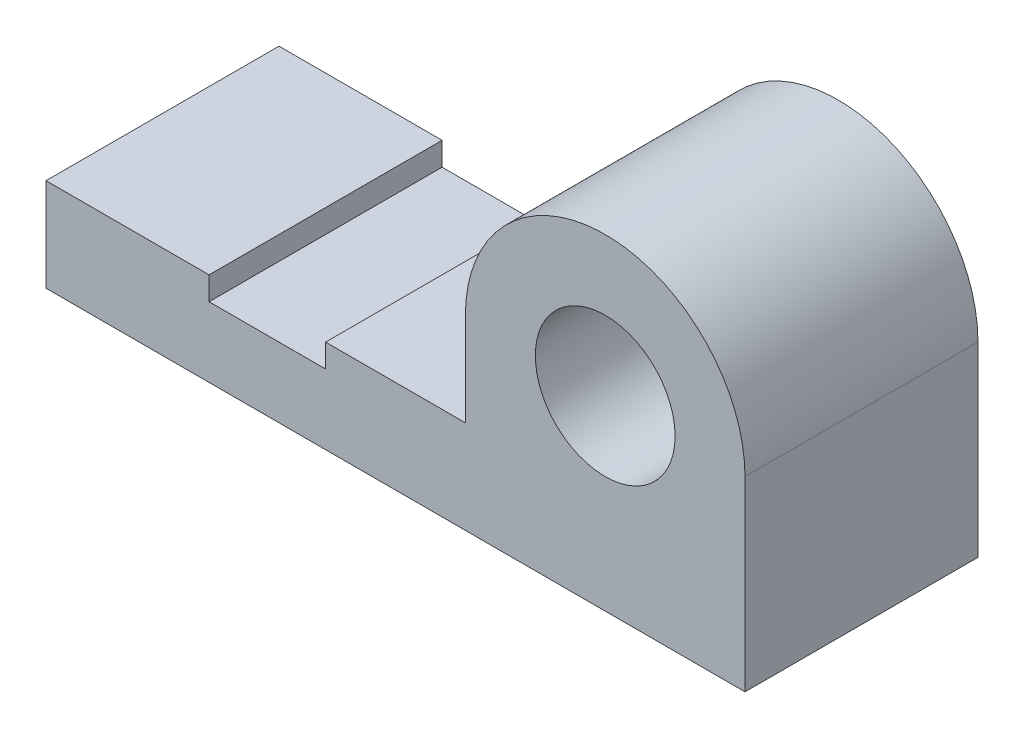
ISO-10303-21;
HEADER;
FILE_DESCRIPTION(('STEP AP214'),'2;1');
FILE_NAME('part.step','',(''),(''),'','','');
FILE_SCHEMA(('AUTOMOTIVE_DESIGN { 1 0 10303 214 1 1 1 1 }'));
ENDSEC;
DATA;
#1=APPLICATION_CONTEXT('core data for automotive mechanical design processes');
#2=APPLICATION_PROTOCOL_DEFINITION('international standard','automotive_design',2000,#1);
#3=PRODUCT_CONTEXT('',#1,'mechanical');
#4=PRODUCT('Part','Part','',(#3));
#5=PRODUCT_RELATED_PRODUCT_CATEGORY('part','',(#4));
#6=PRODUCT_DEFINITION_FORMATION('','',#4);
#7=PRODUCT_DEFINITION_CONTEXT('part definition',#1,'design');
#8=PRODUCT_DEFINITION('design','',#6,#7);
#9=PRODUCT_DEFINITION_SHAPE('','',#8);
#10=(LENGTH_UNIT() NAMED_UNIT(*) SI_UNIT(.MILLI.,.METRE.));
#11=(NAMED_UNIT(*) PLANE_ANGLE_UNIT() SI_UNIT($,.RADIAN.));
#12=(NAMED_UNIT(*) SI_UNIT($,.STERADIAN.) SOLID_ANGLE_UNIT());
#13=UNCERTAINTY_MEASURE_WITH_UNIT(LENGTH_MEASURE(1.E-05),#10,'distance_accuracy_value','');
#14=(GEOMETRIC_REPRESENTATION_CONTEXT(3) GLOBAL_UNCERTAINTY_ASSIGNED_CONTEXT((#13)) GLOBAL_UNIT_ASSIGNED_CONTEXT((#10,
#11,#12)) REPRESENTATION_CONTEXT('',''));
#15=CARTESIAN_POINT('',(0.,0.,0.));
#16=DIRECTION('',(0.,0.,1.));
#17=DIRECTION('',(1.,0.,0.));
#18=AXIS2_PLACEMENT_3D('',#15,#16,#17);
#19=CARTESIAN_POINT('',(-30.,40.,50.));
#20=DIRECTION('',(0.,0.,-1.));
#21=DIRECTION('',(-1.,0.,0.));
#22=AXIS2_PLACEMENT_3D('',#19,#20,#21);
#23=CYLINDRICAL_SURFACE('',#22,30.);
#24=CARTESIAN_POINT('',(-30.,40.,0.));
#25=DIRECTION('',(0.,0.,1.));
#26=DIRECTION('',(1.,0.,0.));
#27=AXIS2_PLACEMENT_3D('',#24,#25,#26);
#28=CIRCLE('',#27,30.);
#29=CARTESIAN_POINT('',(-60.,40.,0.));
#30=VERTEX_POINT('',#29);
#31=CARTESIAN_POINT('',(0.,40.,0.));
#32=VERTEX_POINT('',#31);
#33=EDGE_CURVE('E146',#30,#32,#28,.F.);
#34=ORIENTED_EDGE('',*,*,#33,.F.);
#35=DIRECTION('',(0.,0.,-1.));
#36=VECTOR('',#35,1.);
#37=CARTESIAN_POINT('',(-60.,40.,50.));
#38=LINE('',#37,#36);
#39=CARTESIAN_POINT('',(-60.,40.,50.));
#40=VERTEX_POINT('',#39);
#41=EDGE_CURVE('E11',#40,#30,#38,.T.);
#42=ORIENTED_EDGE('',*,*,#41,.F.);
#43=CARTESIAN_POINT('',(-30.,40.,50.));
#44=DIRECTION('',(0.,0.,1.));
#45=DIRECTION('',(1.,0.,0.));
#46=AXIS2_PLACEMENT_3D('',#43,#44,#45);
#47=CIRCLE('',#46,30.);
#48=CARTESIAN_POINT('',(0.,40.,50.));
#49=VERTEX_POINT('',#48);
#50=EDGE_CURVE('E209',#40,#49,#47,.F.);
#51=ORIENTED_EDGE('',*,*,#50,.T.);
#52=DIRECTION('',(0.,0.,-1.));
#53=VECTOR('',#52,1.);
#54=CARTESIAN_POINT('',(0.,40.,50.));
#55=LINE('',#54,#53);
#56=EDGE_CURVE('E54',#49,#32,#55,.T.);
#57=ORIENTED_EDGE('',*,*,#56,.T.);
#58=EDGE_LOOP('',(#34,#42,#51,#57));
#59=FACE_BOUND('',#58,.T.);
#60=ADVANCED_FACE('F37',(#59),#23,.T.);
#61=CARTESIAN_POINT('',(-60.,0.,50.));
#62=DIRECTION('',(-1.,0.,0.));
#63=DIRECTION('',(0.,-1.,0.));
#64=AXIS2_PLACEMENT_3D('',#61,#62,#63);
#65=PLANE('',#64);
#66=DIRECTION('',(0.,1.,0.));
#67=VECTOR('',#66,1.);
#68=CARTESIAN_POINT('',(-60.,0.,0.));
#69=LINE('',#68,#67);
#70=CARTESIAN_POINT('',(-60.,20.,0.));
#71=VERTEX_POINT('',#70);
#72=EDGE_CURVE('E148',#71,#30,#69,.T.);
#73=ORIENTED_EDGE('',*,*,#72,.F.);
#74=DIRECTION('',(0.,0.,-1.));
#75=VECTOR('',#74,1.);
#76=CARTESIAN_POINT('',(-60.,20.,50.));
#77=LINE('',#76,#75);
#78=CARTESIAN_POINT('',(-60.,20.,50.));
#79=VERTEX_POINT('',#78);
#80=EDGE_CURVE('E46',#79,#71,#77,.T.);
#81=ORIENTED_EDGE('',*,*,#80,.F.);
#82=DIRECTION('',(0.,1.,0.));
#83=VECTOR('',#82,1.);
#84=CARTESIAN_POINT('',(-60.,0.,50.));
#85=LINE('',#84,#83);
#86=EDGE_CURVE('E205',#79,#40,#85,.T.);
#87=ORIENTED_EDGE('',*,*,#86,.T.);
#88=ORIENTED_EDGE('',*,*,#41,.T.);
#89=EDGE_LOOP('',(#73,#81,#87,#88));
#90=FACE_BOUND('',#89,.T.);
#91=ADVANCED_FACE('F193',(#90),#65,.T.);
#92=CARTESIAN_POINT('',(0.,20.,50.));
#93=DIRECTION('',(0.,1.,0.));
#94=DIRECTION('',(0.,0.,1.));
#95=AXIS2_PLACEMENT_3D('',#92,#93,#94);
#96=PLANE('',#95);
#97=DIRECTION('',(1.,0.,0.));
#98=VECTOR('',#97,1.);
#99=CARTESIAN_POINT('',(0.,20.,0.));
#100=LINE('',#99,#98);
#101=CARTESIAN_POINT('',(-90.,20.,0.));
#102=VERTEX_POINT('',#101);
#103=EDGE_CURVE('E151',#102,#71,#100,.T.);
#104=ORIENTED_EDGE('',*,*,#103,.F.);
#105=DIRECTION('',(0.,0.,-1.));
#106=VECTOR('',#105,1.);
#107=CARTESIAN_POINT('',(-90.,20.,50.));
#108=LINE('',#107,#106);
#109=CARTESIAN_POINT('',(-90.,20.,50.));
#110=VERTEX_POINT('',#109);
#111=EDGE_CURVE('E182',#110,#102,#108,.T.);
#112=ORIENTED_EDGE('',*,*,#111,.F.);
#113=DIRECTION('',(1.,0.,0.));
#114=VECTOR('',#113,1.);
#115=CARTESIAN_POINT('',(0.,20.,50.));
#116=LINE('',#115,#114);
#117=EDGE_CURVE('E189',#110,#79,#116,.T.);
#118=ORIENTED_EDGE('',*,*,#117,.T.);
#119=ORIENTED_EDGE('',*,*,#80,.T.);
#120=EDGE_LOOP('',(#104,#112,#118,#119));
#121=FACE_BOUND('',#120,.T.);
#122=ADVANCED_FACE('F187',(#121),#96,.T.);
#123=CARTESIAN_POINT('',(-90.,0.,50.));
#124=DIRECTION('',(-1.,0.,0.));
#125=DIRECTION('',(0.,0.,1.));
#126=AXIS2_PLACEMENT_3D('',#123,#124,#125);
#127=PLANE('',#126);
#128=DIRECTION('',(0.,1.,0.));
#129=VECTOR('',#128,1.);
#130=CARTESIAN_POINT('',(-90.,0.,0.));
#131=LINE('',#130,#129);
#132=CARTESIAN_POINT('',(-90.,15.,0.));
#133=VERTEX_POINT('',#132);
#134=EDGE_CURVE('E154',#133,#102,#131,.T.);
#135=ORIENTED_EDGE('',*,*,#134,.F.);
#136=DIRECTION('',(0.,0.,-1.));
#137=VECTOR('',#136,1.);
#138=CARTESIAN_POINT('',(-90.,15.,50.));
#139=LINE('',#138,#137);
#140=CARTESIAN_POINT('',(-90.,15.,50.));
#141=VERTEX_POINT('',#140);
#142=EDGE_CURVE('E180',#141,#133,#139,.T.);
#143=ORIENTED_EDGE('',*,*,#142,.F.);
#144=DIRECTION('',(0.,1.,0.));
#145=VECTOR('',#144,1.);
#146=CARTESIAN_POINT('',(-90.,0.,50.));
#147=LINE('',#146,#145);
#148=EDGE_CURVE('E202',#141,#110,#147,.T.);
#149=ORIENTED_EDGE('',*,*,#148,.T.);
#150=ORIENTED_EDGE('',*,*,#111,.T.);
#151=EDGE_LOOP('',(#135,#143,#149,#150));
#152=FACE_BOUND('',#151,.T.);
#153=ADVANCED_FACE('F199',(#152),#127,.T.);
#154=CARTESIAN_POINT('',(0.,15.,50.));
#155=DIRECTION('',(0.,1.,0.));
#156=DIRECTION('',(-1.,0.,0.));
#157=AXIS2_PLACEMENT_3D('',#154,#155,#156);
#158=PLANE('',#157);
#159=DIRECTION('',(1.,0.,0.));
#160=VECTOR('',#159,1.);
#161=CARTESIAN_POINT('',(0.,15.,0.));
#162=LINE('',#161,#160);
#163=CARTESIAN_POINT('',(-115.,15.,0.));
#164=VERTEX_POINT('',#163);
#165=EDGE_CURVE('E157',#164,#133,#162,.T.);
#166=ORIENTED_EDGE('',*,*,#165,.F.);
#167=DIRECTION('',(0.,0.,-1.));
#168=VECTOR('',#167,1.);
#169=CARTESIAN_POINT('',(-115.,15.,50.));
#170=LINE('',#169,#168);
#171=CARTESIAN_POINT('',(-115.,15.,50.));
#172=VERTEX_POINT('',#171);
#173=EDGE_CURVE('E178',#172,#164,#170,.T.);
#174=ORIENTED_EDGE('',*,*,#173,.F.);
#175=DIRECTION('',(1.,0.,0.));
#176=VECTOR('',#175,1.);
#177=CARTESIAN_POINT('',(0.,15.,50.));
#178=LINE('',#177,#176);
#179=EDGE_CURVE('E207',#172,#141,#178,.T.);
#180=ORIENTED_EDGE('',*,*,#179,.T.);
#181=ORIENTED_EDGE('',*,*,#142,.T.);
#182=EDGE_LOOP('',(#166,#174,#180,#181));
#183=FACE_BOUND('',#182,.T.);
#184=ADVANCED_FACE('F242',(#183),#158,.T.);
#185=CARTESIAN_POINT('',(-115.,0.,50.));
#186=DIRECTION('',(1.,0.,0.));
#187=DIRECTION('',(0.,0.,-1.));
#188=AXIS2_PLACEMENT_3D('',#185,#186,#187);
#189=PLANE('',#188);
#190=DIRECTION('',(0.,-1.,0.));
#191=VECTOR('',#190,1.);
#192=CARTESIAN_POINT('',(-115.,0.,0.));
#193=LINE('',#192,#191);
#194=CARTESIAN_POINT('',(-115.,20.,0.));
#195=VERTEX_POINT('',#194);
#196=EDGE_CURVE('E160',#195,#164,#193,.T.);
#197=ORIENTED_EDGE('',*,*,#196,.F.);
#198=DIRECTION('',(0.,0.,-1.));
#199=VECTOR('',#198,1.);
#200=CARTESIAN_POINT('',(-115.,20.,50.));
#201=LINE('',#200,#199);
#202=CARTESIAN_POINT('',(-115.,20.,50.));
#203=VERTEX_POINT('',#202);
#204=EDGE_CURVE('E176',#203,#195,#201,.T.);
#205=ORIENTED_EDGE('',*,*,#204,.F.);
#206=DIRECTION('',(0.,-1.,0.));
#207=VECTOR('',#206,1.);
#208=CARTESIAN_POINT('',(-115.,0.,50.));
#209=LINE('',#208,#207);
#210=EDGE_CURVE('E214',#203,#172,#209,.T.);
#211=ORIENTED_EDGE('',*,*,#210,.T.);
#212=ORIENTED_EDGE('',*,*,#173,.T.);
#213=EDGE_LOOP('',(#197,#205,#211,#212));
#214=FACE_BOUND('',#213,.T.);
#215=ADVANCED_FACE('F245',(#214),#189,.T.);
#216=CARTESIAN_POINT('',(0.,20.,50.));
#217=DIRECTION('',(0.,1.,0.));
#218=DIRECTION('',(0.,0.,1.));
#219=AXIS2_PLACEMENT_3D('',#216,#217,#218);
#220=PLANE('',#219);
#221=DIRECTION('',(1.,0.,0.));
#222=VECTOR('',#221,1.);
#223=CARTESIAN_POINT('',(0.,20.,0.));
#224=LINE('',#223,#222);
#225=CARTESIAN_POINT('',(-150.,20.,0.));
#226=VERTEX_POINT('',#225);
#227=EDGE_CURVE('E163',#226,#195,#224,.T.);
#228=ORIENTED_EDGE('',*,*,#227,.F.);
#229=DIRECTION('',(0.,0.,-1.));
#230=VECTOR('',#229,1.);
#231=CARTESIAN_POINT('',(-150.,20.,50.));
#232=LINE('',#231,#230);
#233=CARTESIAN_POINT('',(-150.,20.,50.));
#234=VERTEX_POINT('',#233);
#235=EDGE_CURVE('E125',#234,#226,#232,.T.);
#236=ORIENTED_EDGE('',*,*,#235,.F.);
#237=DIRECTION('',(1.,0.,0.));
#238=VECTOR('',#237,1.);
#239=CARTESIAN_POINT('',(0.,20.,50.));
#240=LINE('',#239,#238);
#241=EDGE_CURVE('E135',#234,#203,#240,.T.);
#242=ORIENTED_EDGE('',*,*,#241,.T.);
#243=ORIENTED_EDGE('',*,*,#204,.T.);
#244=EDGE_LOOP('',(#228,#236,#242,#243));
#245=FACE_BOUND('',#244,.T.);
#246=ADVANCED_FACE('F218',(#245),#220,.T.);
#247=CARTESIAN_POINT('',(-150.,0.,50.));
#248=DIRECTION('',(-1.,0.,0.));
#249=DIRECTION('',(0.,0.,1.));
#250=AXIS2_PLACEMENT_3D('',#247,#248,#249);
#251=PLANE('',#250);
#252=DIRECTION('',(0.,1.,0.));
#253=VECTOR('',#252,1.);
#254=CARTESIAN_POINT('',(-150.,0.,0.));
#255=LINE('',#254,#253);
#256=CARTESIAN_POINT('',(-150.,0.,0.));
#257=VERTEX_POINT('',#256);
#258=EDGE_CURVE('E121',#257,#226,#255,.T.);
#259=ORIENTED_EDGE('',*,*,#258,.F.);
#260=DIRECTION('',(0.,0.,-1.));
#261=VECTOR('',#260,1.);
#262=CARTESIAN_POINT('',(-150.,0.,50.));
#263=LINE('',#262,#261);
#264=CARTESIAN_POINT('',(-150.,0.,50.));
#265=VERTEX_POINT('',#264);
#266=EDGE_CURVE('E116',#265,#257,#263,.T.);
#267=ORIENTED_EDGE('',*,*,#266,.F.);
#268=DIRECTION('',(0.,1.,0.));
#269=VECTOR('',#268,1.);
#270=CARTESIAN_POINT('',(-150.,0.,50.));
#271=LINE('',#270,#269);
#272=EDGE_CURVE('E119',#265,#234,#271,.T.);
#273=ORIENTED_EDGE('',*,*,#272,.T.);
#274=ORIENTED_EDGE('',*,*,#235,.T.);
#275=EDGE_LOOP('',(#259,#267,#273,#274));
#276=FACE_BOUND('',#275,.T.);
#277=ADVANCED_FACE('F118',(#276),#251,.T.);
#278=CARTESIAN_POINT('',(0.,0.,50.));
#279=DIRECTION('',(0.,-1.,0.));
#280=DIRECTION('',(0.,0.,-1.));
#281=AXIS2_PLACEMENT_3D('',#278,#279,#280);
#282=PLANE('',#281);
#283=DIRECTION('',(-1.,0.,0.));
#284=VECTOR('',#283,1.);
#285=CARTESIAN_POINT('',(0.,0.,0.));
#286=LINE('',#285,#284);
#287=CARTESIAN_POINT('',(0.,0.,0.));
#288=VERTEX_POINT('',#287);
#289=EDGE_CURVE('E167',#288,#257,#286,.T.);
#290=ORIENTED_EDGE('',*,*,#289,.F.);
#291=DIRECTION('',(0.,0.,-1.));
#292=VECTOR('',#291,1.);
#293=CARTESIAN_POINT('',(0.,0.,50.));
#294=LINE('',#293,#292);
#295=CARTESIAN_POINT('',(0.,0.,50.));
#296=VERTEX_POINT('',#295);
#297=EDGE_CURVE('E85',#296,#288,#294,.T.);
#298=ORIENTED_EDGE('',*,*,#297,.F.);
#299=DIRECTION('',(-1.,0.,0.));
#300=VECTOR('',#299,1.);
#301=CARTESIAN_POINT('',(0.,0.,50.));
#302=LINE('',#301,#300);
#303=EDGE_CURVE('E132',#296,#265,#302,.T.);
#304=ORIENTED_EDGE('',*,*,#303,.T.);
#305=ORIENTED_EDGE('',*,*,#266,.T.);
#306=EDGE_LOOP('',(#290,#298,#304,#305));
#307=FACE_BOUND('',#306,.T.);
#308=ADVANCED_FACE('F137',(#307),#282,.T.);
#309=CARTESIAN_POINT('',(-30.,40.,50.));
#310=DIRECTION('',(0.,0.,-1.));
#311=DIRECTION('',(-1.,0.,0.));
#312=AXIS2_PLACEMENT_3D('',#309,#310,#311);
#313=CYLINDRICAL_SURFACE('',#312,15.);
#314=CARTESIAN_POINT('',(-30.,40.,50.));
#315=DIRECTION('',(0.,0.,1.));
#316=DIRECTION('',(1.,0.,0.));
#317=AXIS2_PLACEMENT_3D('',#314,#315,#316);
#318=CIRCLE('',#317,15.);
#319=CARTESIAN_POINT('',(-15.,40.,50.));
#320=VERTEX_POINT('',#319);
#321=EDGE_CURVE('E172',#320,#320,#318,.T.);
#322=ORIENTED_EDGE('',*,*,#321,.T.);
#323=EDGE_LOOP('',(#322));
#324=FACE_BOUND('',#323,.T.);
#325=CARTESIAN_POINT('',(-30.,40.,0.));
#326=DIRECTION('',(0.,0.,1.));
#327=DIRECTION('',(1.,0.,0.));
#328=AXIS2_PLACEMENT_3D('',#325,#326,#327);
#329=CIRCLE('',#328,15.);
#330=CARTESIAN_POINT('',(-15.,40.,0.));
#331=VERTEX_POINT('',#330);
#332=EDGE_CURVE('E143',#331,#331,#329,.T.);
#333=ORIENTED_EDGE('',*,*,#332,.F.);
#334=EDGE_LOOP('',(#333));
#335=FACE_BOUND('',#334,.T.);
#336=ADVANCED_FACE('F39',(#324,#335),#313,.F.);
#337=CARTESIAN_POINT('',(0.,0.,50.));
#338=DIRECTION('',(1.,0.,0.));
#339=DIRECTION('',(0.,1.,0.));
#340=AXIS2_PLACEMENT_3D('',#337,#338,#339);
#341=PLANE('',#340);
#342=DIRECTION('',(0.,-1.,0.));
#343=VECTOR('',#342,1.);
#344=CARTESIAN_POINT('',(0.,0.,0.));
#345=LINE('',#344,#343);
#346=EDGE_CURVE('E169',#32,#288,#345,.T.);
#347=ORIENTED_EDGE('',*,*,#346,.F.);
#348=ORIENTED_EDGE('',*,*,#56,.F.);
#349=DIRECTION('',(0.,-1.,0.));
#350=VECTOR('',#349,1.);
#351=CARTESIAN_POINT('',(0.,0.,50.));
#352=LINE('',#351,#350);
#353=EDGE_CURVE('E138',#49,#296,#352,.T.);
#354=ORIENTED_EDGE('',*,*,#353,.T.);
#355=ORIENTED_EDGE('',*,*,#297,.T.);
#356=EDGE_LOOP('',(#347,#348,#354,#355));
#357=FACE_BOUND('',#356,.T.);
#358=ADVANCED_FACE('F220',(#357),#341,.T.);
#359=CARTESIAN_POINT('',(0.,0.,50.));
#360=DIRECTION('',(0.,0.,1.));
#361=DIRECTION('',(1.,0.,0.));
#362=AXIS2_PLACEMENT_3D('',#359,#360,#361);
#363=PLANE('',#362);
#364=ORIENTED_EDGE('',*,*,#321,.F.);
#365=EDGE_LOOP('',(#364));
#366=FACE_BOUND('',#365,.T.);
#367=ORIENTED_EDGE('',*,*,#50,.F.);
#368=ORIENTED_EDGE('',*,*,#86,.F.);
#369=ORIENTED_EDGE('',*,*,#117,.F.);
#370=ORIENTED_EDGE('',*,*,#148,.F.);
#371=ORIENTED_EDGE('',*,*,#179,.F.);
#372=ORIENTED_EDGE('',*,*,#210,.F.);
#373=ORIENTED_EDGE('',*,*,#241,.F.);
#374=ORIENTED_EDGE('',*,*,#272,.F.);
#375=ORIENTED_EDGE('',*,*,#303,.F.);
#376=ORIENTED_EDGE('',*,*,#353,.F.);
#377=EDGE_LOOP('',(#367,#368,#369,#370,#371,#372,#373,#374,#375,#376));
#378=FACE_BOUND('',#377,.T.);
#379=ADVANCED_FACE('F130',(#366,#378),#363,.T.);
#380=CARTESIAN_POINT('',(0.,0.,0.));
#381=DIRECTION('',(0.,0.,1.));
#382=DIRECTION('',(1.,0.,0.));
#383=AXIS2_PLACEMENT_3D('',#380,#381,#382);
#384=PLANE('',#383);
#385=ORIENTED_EDGE('',*,*,#332,.T.);
#386=EDGE_LOOP('',(#385));
#387=FACE_BOUND('',#386,.T.);
#388=ORIENTED_EDGE('',*,*,#33,.T.);
#389=ORIENTED_EDGE('',*,*,#346,.T.);
#390=ORIENTED_EDGE('',*,*,#289,.T.);
#391=ORIENTED_EDGE('',*,*,#258,.T.);
#392=ORIENTED_EDGE('',*,*,#227,.T.);
#393=ORIENTED_EDGE('',*,*,#196,.T.);
#394=ORIENTED_EDGE('',*,*,#165,.T.);
#395=ORIENTED_EDGE('',*,*,#134,.T.);
#396=ORIENTED_EDGE('',*,*,#103,.T.);
#397=ORIENTED_EDGE('',*,*,#72,.T.);
#398=EDGE_LOOP('',(#388,#389,#390,#391,#392,#393,#394,#395,#396,#397));
#399=FACE_BOUND('',#398,.T.);
#400=ADVANCED_FACE('F195',(#387,#399),#384,.F.);
#401=CLOSED_SHELL('',(#60,#91,#122,#153,#184,#215,#246,#277,#308,#336,#358,#379,#400));
#402=MANIFOLD_SOLID_BREP('B2',#401);
#403=ADVANCED_BREP_SHAPE_REPRESENTATION('',(#18,#402),#14);
#404=SHAPE_DEFINITION_REPRESENTATION(#9,#403);
ENDSEC;
END-ISO-10303-21;
